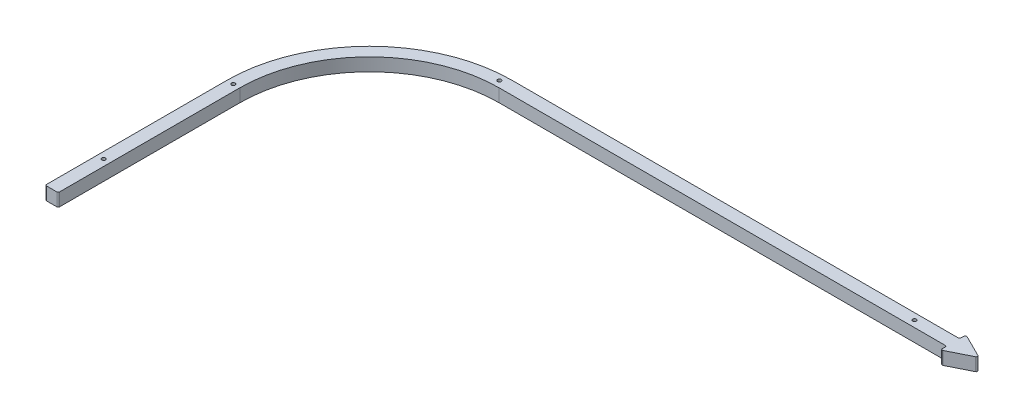
ISO-10303-21;
HEADER;
FILE_DESCRIPTION(('STEP AP214'),'2;1');
FILE_NAME('part.step','',(''),(''),'','','');
FILE_SCHEMA(('AUTOMOTIVE_DESIGN { 1 0 10303 214 1 1 1 1 }'));
ENDSEC;
DATA;
#1=APPLICATION_CONTEXT('core data for automotive mechanical design processes');
#2=APPLICATION_PROTOCOL_DEFINITION('international standard','automotive_design',2000,#1);
#3=PRODUCT_CONTEXT('',#1,'mechanical');
#4=PRODUCT('Part','Part','',(#3));
#5=PRODUCT_RELATED_PRODUCT_CATEGORY('part','',(#4));
#6=PRODUCT_DEFINITION_FORMATION('','',#4);
#7=PRODUCT_DEFINITION_CONTEXT('part definition',#1,'design');
#8=PRODUCT_DEFINITION('design','',#6,#7);
#9=PRODUCT_DEFINITION_SHAPE('','',#8);
#10=(LENGTH_UNIT() NAMED_UNIT(*) SI_UNIT(.MILLI.,.METRE.));
#11=(NAMED_UNIT(*) PLANE_ANGLE_UNIT() SI_UNIT($,.RADIAN.));
#12=(NAMED_UNIT(*) SI_UNIT($,.STERADIAN.) SOLID_ANGLE_UNIT());
#13=UNCERTAINTY_MEASURE_WITH_UNIT(LENGTH_MEASURE(1.E-05),#10,'distance_accuracy_value','');
#14=(GEOMETRIC_REPRESENTATION_CONTEXT(3) GLOBAL_UNCERTAINTY_ASSIGNED_CONTEXT((#13)) GLOBAL_UNIT_ASSIGNED_CONTEXT((#10,
#11,#12)) REPRESENTATION_CONTEXT('',''));
#15=CARTESIAN_POINT('',(0.,0.,0.));
#16=DIRECTION('',(0.,0.,1.));
#17=DIRECTION('',(1.,0.,0.));
#18=AXIS2_PLACEMENT_3D('',#15,#16,#17);
#19=CARTESIAN_POINT('',(0.,6.35,0.));
#20=DIRECTION('',(0.,1.,0.));
#21=DIRECTION('',(0.,0.,1.));
#22=AXIS2_PLACEMENT_3D('',#19,#20,#21);
#23=PLANE('',#22);
#24=CARTESIAN_POINT('',(3.175,6.35,-25.4));
#25=DIRECTION('',(0.,1.,0.));
#26=DIRECTION('',(0.,0.,1.));
#27=AXIS2_PLACEMENT_3D('',#24,#25,#26);
#28=CIRCLE('',#27,0.889);
#29=CARTESIAN_POINT('',(3.175,6.35,-24.511));
#30=VERTEX_POINT('',#29);
#31=EDGE_CURVE('E384',#30,#30,#28,.T.);
#32=ORIENTED_EDGE('',*,*,#31,.F.);
#33=EDGE_LOOP('',(#32));
#34=FACE_BOUND('',#33,.T.);
#35=CARTESIAN_POINT('',(66.8019999999998,6.35,-155.575));
#36=DIRECTION('',(0.,1.,0.));
#37=DIRECTION('',(0.,0.,1.));
#38=AXIS2_PLACEMENT_3D('',#35,#36,#37);
#39=CIRCLE('',#38,0.889000000000006);
#40=CARTESIAN_POINT('',(66.8019999999998,6.35,-154.686));
#41=VERTEX_POINT('',#40);
#42=EDGE_CURVE('E378',#41,#41,#39,.T.);
#43=ORIENTED_EDGE('',*,*,#42,.F.);
#44=EDGE_LOOP('',(#43));
#45=FACE_BOUND('',#44,.T.);
#46=CARTESIAN_POINT('',(3.17499999999978,6.35,-88.9));
#47=DIRECTION('',(0.,1.,0.));
#48=DIRECTION('',(0.,0.,1.));
#49=AXIS2_PLACEMENT_3D('',#46,#47,#48);
#50=CIRCLE('',#49,0.888999999999999);
#51=CARTESIAN_POINT('',(3.17499999999978,6.35,-88.011));
#52=VERTEX_POINT('',#51);
#53=EDGE_CURVE('E372',#52,#52,#50,.T.);
#54=ORIENTED_EDGE('',*,*,#53,.F.);
#55=EDGE_LOOP('',(#54));
#56=FACE_BOUND('',#55,.T.);
#57=CARTESIAN_POINT('',(270.002,6.35,-155.575));
#58=DIRECTION('',(0.,1.,0.));
#59=DIRECTION('',(0.,0.,1.));
#60=AXIS2_PLACEMENT_3D('',#57,#58,#59);
#61=CIRCLE('',#60,0.888999999999993);
#62=CARTESIAN_POINT('',(270.002,6.35,-154.686));
#63=VERTEX_POINT('',#62);
#64=EDGE_CURVE('E366',#63,#63,#61,.T.);
#65=ORIENTED_EDGE('',*,*,#64,.F.);
#66=EDGE_LOOP('',(#65));
#67=FACE_BOUND('',#66,.T.);
#68=DIRECTION('',(0.,0.,-1.));
#69=VECTOR('',#68,1.);
#70=CARTESIAN_POINT('',(0.,6.35,0.));
#71=LINE('',#70,#69);
#72=CARTESIAN_POINT('',(0.,6.35,-0.635));
#73=VERTEX_POINT('',#72);
#74=CARTESIAN_POINT('',(0.,6.35,-88.9));
#75=VERTEX_POINT('',#74);
#76=EDGE_CURVE('E232',#73,#75,#71,.T.);
#77=ORIENTED_EDGE('',*,*,#76,.F.);
#78=CARTESIAN_POINT('',(0.635,6.35,-0.635));
#79=DIRECTION('',(0.,1.,0.));
#80=DIRECTION('',(0.,0.,1.));
#81=AXIS2_PLACEMENT_3D('',#78,#79,#80);
#82=CIRCLE('',#81,0.635);
#83=CARTESIAN_POINT('',(0.635,6.35,0.));
#84=VERTEX_POINT('',#83);
#85=EDGE_CURVE('E288',#73,#84,#82,.T.);
#86=ORIENTED_EDGE('',*,*,#85,.T.);
#87=DIRECTION('',(1.,0.,0.));
#88=VECTOR('',#87,1.);
#89=CARTESIAN_POINT('',(0.,6.35,0.));
#90=LINE('',#89,#88);
#91=CARTESIAN_POINT('',(5.715,6.35,0.));
#92=VERTEX_POINT('',#91);
#93=EDGE_CURVE('E206',#84,#92,#90,.T.);
#94=ORIENTED_EDGE('',*,*,#93,.T.);
#95=CARTESIAN_POINT('',(5.715,6.35,-0.635));
#96=DIRECTION('',(0.,1.,0.));
#97=DIRECTION('',(0.,0.,1.));
#98=AXIS2_PLACEMENT_3D('',#95,#96,#97);
#99=CIRCLE('',#98,0.635);
#100=CARTESIAN_POINT('',(6.35,6.35,-0.635));
#101=VERTEX_POINT('',#100);
#102=EDGE_CURVE('E202',#92,#101,#99,.T.);
#103=ORIENTED_EDGE('',*,*,#102,.T.);
#104=DIRECTION('',(0.,0.,-1.));
#105=VECTOR('',#104,1.);
#106=CARTESIAN_POINT('',(6.35,6.35,0.));
#107=LINE('',#106,#105);
#108=CARTESIAN_POINT('',(6.35,6.35,-88.9));
#109=VERTEX_POINT('',#108);
#110=EDGE_CURVE('E194',#101,#109,#107,.T.);
#111=ORIENTED_EDGE('',*,*,#110,.T.);
#112=CARTESIAN_POINT('',(69.85,6.35,-88.9));
#113=DIRECTION('',(0.,1.,0.));
#114=DIRECTION('',(0.,0.,1.));
#115=AXIS2_PLACEMENT_3D('',#112,#113,#114);
#116=CIRCLE('',#115,63.5);
#117=CARTESIAN_POINT('',(69.85,6.35,-152.4));
#118=VERTEX_POINT('',#117);
#119=EDGE_CURVE('E198',#109,#118,#116,.F.);
#120=ORIENTED_EDGE('',*,*,#119,.T.);
#121=DIRECTION('',(1.,0.,0.));
#122=VECTOR('',#121,1.);
#123=CARTESIAN_POINT('',(0.,6.35,-152.4));
#124=LINE('',#123,#122);
#125=CARTESIAN_POINT('',(288.29,6.35,-152.4));
#126=VERTEX_POINT('',#125);
#127=EDGE_CURVE('E221',#118,#126,#124,.T.);
#128=ORIENTED_EDGE('',*,*,#127,.T.);
#129=CARTESIAN_POINT('',(288.29,6.35,-151.765));
#130=DIRECTION('',(0.,1.,0.));
#131=DIRECTION('',(0.,0.,1.));
#132=AXIS2_PLACEMENT_3D('',#129,#130,#131);
#133=CIRCLE('',#132,0.635);
#134=CARTESIAN_POINT('',(288.925,6.35,-151.765));
#135=VERTEX_POINT('',#134);
#136=EDGE_CURVE('E85',#126,#135,#133,.F.);
#137=ORIENTED_EDGE('',*,*,#136,.T.);
#138=DIRECTION('',(0.,0.,-1.));
#139=VECTOR('',#138,1.);
#140=CARTESIAN_POINT('',(288.925,6.35,-149.225));
#141=LINE('',#140,#139);
#142=CARTESIAN_POINT('',(288.925,6.35,-150.252451582856));
#143=VERTEX_POINT('',#142);
#144=EDGE_CURVE('E238',#143,#135,#141,.T.);
#145=ORIENTED_EDGE('',*,*,#144,.F.);
#146=CARTESIAN_POINT('',(289.56,6.35000000000002,-150.252451582856));
#147=DIRECTION('',(0.,1.,0.));
#148=DIRECTION('',(0.,0.,1.));
#149=AXIS2_PLACEMENT_3D('',#146,#147,#148);
#150=CIRCLE('',#149,0.635);
#151=CARTESIAN_POINT('',(289.843980633143,6.35,-149.684490316571));
#152=VERTEX_POINT('',#151);
#153=EDGE_CURVE('E285',#143,#152,#150,.T.);
#154=ORIENTED_EDGE('',*,*,#153,.T.);
#155=DIRECTION('',(0.894427190999917,0.,-0.447213595499956));
#156=VECTOR('',#155,1.);
#157=CARTESIAN_POINT('',(-1.90500000000027,6.35,-3.81000000000056));
#158=LINE('',#157,#156);
#159=CARTESIAN_POINT('',(300.48907746743,6.35,-155.007038733715));
#160=VERTEX_POINT('',#159);
#161=EDGE_CURVE('E264',#152,#160,#158,.T.);
#162=ORIENTED_EDGE('',*,*,#161,.T.);
#163=CARTESIAN_POINT('',(300.205096834288,6.35000000000002,-155.575));
#164=DIRECTION('',(0.,1.,0.));
#165=DIRECTION('',(0.,0.,1.));
#166=AXIS2_PLACEMENT_3D('',#163,#164,#165);
#167=CIRCLE('',#166,0.635);
#168=CARTESIAN_POINT('',(300.48907746743,6.35,-156.142961266285));
#169=VERTEX_POINT('',#168);
#170=EDGE_CURVE('E283',#160,#169,#167,.T.);
#171=ORIENTED_EDGE('',*,*,#170,.T.);
#172=DIRECTION('',(-0.894427190999916,0.,-0.447213595499958));
#173=VECTOR('',#172,1.);
#174=CARTESIAN_POINT('',(122.555,6.35,-245.11));
#175=LINE('',#174,#173);
#176=CARTESIAN_POINT('',(289.843980633143,6.35,-161.465509683429));
#177=VERTEX_POINT('',#176);
#178=EDGE_CURVE('E359',#169,#177,#175,.T.);
#179=ORIENTED_EDGE('',*,*,#178,.T.);
#180=CARTESIAN_POINT('',(289.56,6.35,-160.897548417144));
#181=DIRECTION('',(0.,1.,0.));
#182=DIRECTION('',(0.,0.,1.));
#183=AXIS2_PLACEMENT_3D('',#180,#181,#182);
#184=CIRCLE('',#183,0.635);
#185=CARTESIAN_POINT('',(288.925,6.35,-160.897548417144));
#186=VERTEX_POINT('',#185);
#187=EDGE_CURVE('E281',#177,#186,#184,.T.);
#188=ORIENTED_EDGE('',*,*,#187,.T.);
#189=CARTESIAN_POINT('',(288.925,6.35,-159.385));
#190=VERTEX_POINT('',#189);
#191=EDGE_CURVE('E259',#190,#186,#141,.T.);
#192=ORIENTED_EDGE('',*,*,#191,.F.);
#193=CARTESIAN_POINT('',(288.29,6.35,-159.385));
#194=DIRECTION('',(0.,1.,0.));
#195=DIRECTION('',(0.,0.,1.));
#196=AXIS2_PLACEMENT_3D('',#193,#194,#195);
#197=CIRCLE('',#196,0.635);
#198=CARTESIAN_POINT('',(288.29,6.35,-158.75));
#199=VERTEX_POINT('',#198);
#200=EDGE_CURVE('E12',#190,#199,#197,.F.);
#201=ORIENTED_EDGE('',*,*,#200,.T.);
#202=DIRECTION('',(1.,0.,0.));
#203=VECTOR('',#202,1.);
#204=CARTESIAN_POINT('',(0.,6.35,-158.75));
#205=LINE('',#204,#203);
#206=CARTESIAN_POINT('',(69.85,6.35,-158.75));
#207=VERTEX_POINT('',#206);
#208=EDGE_CURVE('E223',#207,#199,#205,.T.);
#209=ORIENTED_EDGE('',*,*,#208,.F.);
#210=CARTESIAN_POINT('',(69.85,6.35,-88.9));
#211=DIRECTION('',(0.,1.,0.));
#212=DIRECTION('',(0.,0.,1.));
#213=AXIS2_PLACEMENT_3D('',#210,#211,#212);
#214=CIRCLE('',#213,69.85);
#215=EDGE_CURVE('E229',#75,#207,#214,.F.);
#216=ORIENTED_EDGE('',*,*,#215,.F.);
#217=EDGE_LOOP('',(#77,#86,#94,#103,#111,#120,#128,#137,#145,#154,#162,#171,#179,#188,#192,#201,
#209,#216));
#218=FACE_BOUND('',#217,.T.);
#219=ADVANCED_FACE('F70',(#34,#45,#56,#67,#218),#23,.T.);
#220=CARTESIAN_POINT('',(0.,0.,0.));
#221=DIRECTION('',(0.,1.,0.));
#222=DIRECTION('',(0.,0.,1.));
#223=AXIS2_PLACEMENT_3D('',#220,#221,#222);
#224=PLANE('',#223);
#225=CARTESIAN_POINT('',(3.175,0.,-25.4));
#226=DIRECTION('',(0.,1.,0.));
#227=DIRECTION('',(0.,0.,1.));
#228=AXIS2_PLACEMENT_3D('',#225,#226,#227);
#229=CIRCLE('',#228,0.889);
#230=CARTESIAN_POINT('',(3.175,0.,-24.511));
#231=VERTEX_POINT('',#230);
#232=EDGE_CURVE('E365',#231,#231,#229,.T.);
#233=ORIENTED_EDGE('',*,*,#232,.T.);
#234=EDGE_LOOP('',(#233));
#235=FACE_BOUND('',#234,.T.);
#236=CARTESIAN_POINT('',(66.8019999999998,0.,-155.575));
#237=DIRECTION('',(0.,1.,0.));
#238=DIRECTION('',(0.,0.,1.));
#239=AXIS2_PLACEMENT_3D('',#236,#237,#238);
#240=CIRCLE('',#239,0.889000000000006);
#241=CARTESIAN_POINT('',(66.8019999999998,0.,-154.686));
#242=VERTEX_POINT('',#241);
#243=EDGE_CURVE('E381',#242,#242,#240,.T.);
#244=ORIENTED_EDGE('',*,*,#243,.T.);
#245=EDGE_LOOP('',(#244));
#246=FACE_BOUND('',#245,.T.);
#247=CARTESIAN_POINT('',(3.17499999999978,0.,-88.9));
#248=DIRECTION('',(0.,1.,0.));
#249=DIRECTION('',(0.,0.,1.));
#250=AXIS2_PLACEMENT_3D('',#247,#248,#249);
#251=CIRCLE('',#250,0.888999999999999);
#252=CARTESIAN_POINT('',(3.17499999999978,0.,-88.011));
#253=VERTEX_POINT('',#252);
#254=EDGE_CURVE('E375',#253,#253,#251,.T.);
#255=ORIENTED_EDGE('',*,*,#254,.T.);
#256=EDGE_LOOP('',(#255));
#257=FACE_BOUND('',#256,.T.);
#258=CARTESIAN_POINT('',(270.002,0.,-155.575));
#259=DIRECTION('',(0.,1.,0.));
#260=DIRECTION('',(0.,0.,1.));
#261=AXIS2_PLACEMENT_3D('',#258,#259,#260);
#262=CIRCLE('',#261,0.888999999999993);
#263=CARTESIAN_POINT('',(270.002,0.,-154.686));
#264=VERTEX_POINT('',#263);
#265=EDGE_CURVE('E369',#264,#264,#262,.T.);
#266=ORIENTED_EDGE('',*,*,#265,.T.);
#267=EDGE_LOOP('',(#266));
#268=FACE_BOUND('',#267,.T.);
#269=DIRECTION('',(1.,0.,0.));
#270=VECTOR('',#269,1.);
#271=CARTESIAN_POINT('',(0.,0.,0.));
#272=LINE('',#271,#270);
#273=CARTESIAN_POINT('',(0.635,0.,0.));
#274=VERTEX_POINT('',#273);
#275=CARTESIAN_POINT('',(5.715,0.,0.));
#276=VERTEX_POINT('',#275);
#277=EDGE_CURVE('E235',#274,#276,#272,.T.);
#278=ORIENTED_EDGE('',*,*,#277,.F.);
#279=CARTESIAN_POINT('',(0.635,0.,-0.635));
#280=DIRECTION('',(0.,1.,0.));
#281=DIRECTION('',(0.,0.,1.));
#282=AXIS2_PLACEMENT_3D('',#279,#280,#281);
#283=CIRCLE('',#282,0.635);
#284=CARTESIAN_POINT('',(0.,0.,-0.635));
#285=VERTEX_POINT('',#284);
#286=EDGE_CURVE('E277',#274,#285,#283,.F.);
#287=ORIENTED_EDGE('',*,*,#286,.T.);
#288=DIRECTION('',(0.,0.,-1.));
#289=VECTOR('',#288,1.);
#290=CARTESIAN_POINT('',(0.,0.,0.));
#291=LINE('',#290,#289);
#292=CARTESIAN_POINT('',(0.,0.,-88.9));
#293=VERTEX_POINT('',#292);
#294=EDGE_CURVE('E251',#285,#293,#291,.T.);
#295=ORIENTED_EDGE('',*,*,#294,.T.);
#296=CARTESIAN_POINT('',(69.85,0.,-88.9));
#297=DIRECTION('',(0.,1.,0.));
#298=DIRECTION('',(0.,0.,1.));
#299=AXIS2_PLACEMENT_3D('',#296,#297,#298);
#300=CIRCLE('',#299,69.85);
#301=CARTESIAN_POINT('',(69.85,0.,-158.75));
#302=VERTEX_POINT('',#301);
#303=EDGE_CURVE('E248',#293,#302,#300,.F.);
#304=ORIENTED_EDGE('',*,*,#303,.T.);
#305=DIRECTION('',(1.,0.,0.));
#306=VECTOR('',#305,1.);
#307=CARTESIAN_POINT('',(0.,0.,-158.75));
#308=LINE('',#307,#306);
#309=CARTESIAN_POINT('',(288.29,0.,-158.75));
#310=VERTEX_POINT('',#309);
#311=EDGE_CURVE('E245',#302,#310,#308,.T.);
#312=ORIENTED_EDGE('',*,*,#311,.T.);
#313=CARTESIAN_POINT('',(288.29,0.,-159.385));
#314=DIRECTION('',(0.,1.,0.));
#315=DIRECTION('',(0.,0.,1.));
#316=AXIS2_PLACEMENT_3D('',#313,#314,#315);
#317=CIRCLE('',#316,0.635);
#318=CARTESIAN_POINT('',(288.925,0.,-159.385));
#319=VERTEX_POINT('',#318);
#320=EDGE_CURVE('E78',#310,#319,#317,.T.);
#321=ORIENTED_EDGE('',*,*,#320,.T.);
#322=DIRECTION('',(0.,0.,-1.));
#323=VECTOR('',#322,1.);
#324=CARTESIAN_POINT('',(288.925,0.,-149.225));
#325=LINE('',#324,#323);
#326=CARTESIAN_POINT('',(288.925,0.,-160.897548417144));
#327=VERTEX_POINT('',#326);
#328=EDGE_CURVE('E260',#319,#327,#325,.T.);
#329=ORIENTED_EDGE('',*,*,#328,.T.);
#330=CARTESIAN_POINT('',(289.56,0.,-160.897548417144));
#331=DIRECTION('',(0.,1.,0.));
#332=DIRECTION('',(0.,0.,1.));
#333=AXIS2_PLACEMENT_3D('',#330,#331,#332);
#334=CIRCLE('',#333,0.635);
#335=CARTESIAN_POINT('',(289.843980633143,0.,-161.465509683429));
#336=VERTEX_POINT('',#335);
#337=EDGE_CURVE('E269',#327,#336,#334,.F.);
#338=ORIENTED_EDGE('',*,*,#337,.T.);
#339=DIRECTION('',(-0.894427190999916,0.,-0.447213595499958));
#340=VECTOR('',#339,1.);
#341=CARTESIAN_POINT('',(122.555,0.,-245.11));
#342=LINE('',#341,#340);
#343=CARTESIAN_POINT('',(300.48907746743,0.,-156.142961266285));
#344=VERTEX_POINT('',#343);
#345=EDGE_CURVE('E362',#344,#336,#342,.T.);
#346=ORIENTED_EDGE('',*,*,#345,.F.);
#347=CARTESIAN_POINT('',(300.205096834288,0.,-155.575));
#348=DIRECTION('',(0.,1.,0.));
#349=DIRECTION('',(0.,0.,1.));
#350=AXIS2_PLACEMENT_3D('',#347,#348,#349);
#351=CIRCLE('',#350,0.635);
#352=CARTESIAN_POINT('',(300.48907746743,0.,-155.007038733715));
#353=VERTEX_POINT('',#352);
#354=EDGE_CURVE('E271',#344,#353,#351,.F.);
#355=ORIENTED_EDGE('',*,*,#354,.T.);
#356=DIRECTION('',(0.894427190999917,0.,-0.447213595499956));
#357=VECTOR('',#356,1.);
#358=CARTESIAN_POINT('',(-1.90500000000027,0.,-3.81000000000056));
#359=LINE('',#358,#357);
#360=CARTESIAN_POINT('',(289.843980633143,0.,-149.684490316571));
#361=VERTEX_POINT('',#360);
#362=EDGE_CURVE('E356',#361,#353,#359,.T.);
#363=ORIENTED_EDGE('',*,*,#362,.F.);
#364=CARTESIAN_POINT('',(289.56,0.,-150.252451582856));
#365=DIRECTION('',(0.,1.,0.));
#366=DIRECTION('',(0.,0.,1.));
#367=AXIS2_PLACEMENT_3D('',#364,#365,#366);
#368=CIRCLE('',#367,0.635);
#369=CARTESIAN_POINT('',(288.925,0.,-150.252451582856));
#370=VERTEX_POINT('',#369);
#371=EDGE_CURVE('E273',#361,#370,#368,.F.);
#372=ORIENTED_EDGE('',*,*,#371,.T.);
#373=CARTESIAN_POINT('',(288.925,0.,-151.765));
#374=VERTEX_POINT('',#373);
#375=EDGE_CURVE('E263',#370,#374,#325,.T.);
#376=ORIENTED_EDGE('',*,*,#375,.T.);
#377=CARTESIAN_POINT('',(288.29,0.,-151.765));
#378=DIRECTION('',(0.,1.,0.));
#379=DIRECTION('',(0.,0.,1.));
#380=AXIS2_PLACEMENT_3D('',#377,#378,#379);
#381=CIRCLE('',#380,0.635);
#382=CARTESIAN_POINT('',(288.29,0.,-152.4));
#383=VERTEX_POINT('',#382);
#384=EDGE_CURVE('E316',#374,#383,#381,.T.);
#385=ORIENTED_EDGE('',*,*,#384,.T.);
#386=DIRECTION('',(1.,0.,0.));
#387=VECTOR('',#386,1.);
#388=CARTESIAN_POINT('',(0.,0.,-152.4));
#389=LINE('',#388,#387);
#390=CARTESIAN_POINT('',(69.85,0.,-152.4));
#391=VERTEX_POINT('',#390);
#392=EDGE_CURVE('E242',#391,#383,#389,.T.);
#393=ORIENTED_EDGE('',*,*,#392,.F.);
#394=CARTESIAN_POINT('',(69.85,0.,-88.9));
#395=DIRECTION('',(0.,1.,0.));
#396=DIRECTION('',(0.,0.,1.));
#397=AXIS2_PLACEMENT_3D('',#394,#395,#396);
#398=CIRCLE('',#397,63.5);
#399=CARTESIAN_POINT('',(6.35,0.,-88.9));
#400=VERTEX_POINT('',#399);
#401=EDGE_CURVE('E240',#400,#391,#398,.F.);
#402=ORIENTED_EDGE('',*,*,#401,.F.);
#403=DIRECTION('',(0.,0.,-1.));
#404=VECTOR('',#403,1.);
#405=CARTESIAN_POINT('',(6.35,0.,0.));
#406=LINE('',#405,#404);
#407=CARTESIAN_POINT('',(6.35,0.,-0.635));
#408=VERTEX_POINT('',#407);
#409=EDGE_CURVE('E212',#408,#400,#406,.T.);
#410=ORIENTED_EDGE('',*,*,#409,.F.);
#411=CARTESIAN_POINT('',(5.715,0.,-0.635));
#412=DIRECTION('',(0.,1.,0.));
#413=DIRECTION('',(0.,0.,1.));
#414=AXIS2_PLACEMENT_3D('',#411,#412,#413);
#415=CIRCLE('',#414,0.635);
#416=EDGE_CURVE('E275',#408,#276,#415,.F.);
#417=ORIENTED_EDGE('',*,*,#416,.T.);
#418=EDGE_LOOP('',(#278,#287,#295,#304,#312,#321,#329,#338,#346,#355,#363,#372,#376,#385,#393,
#402,#410,#417));
#419=FACE_BOUND('',#418,.T.);
#420=ADVANCED_FACE('F321',(#235,#246,#257,#268,#419),#224,.F.);
#421=CARTESIAN_POINT('',(0.,6.35,0.));
#422=DIRECTION('',(0.,0.,-1.));
#423=DIRECTION('',(-1.,0.,0.));
#424=AXIS2_PLACEMENT_3D('',#421,#422,#423);
#425=PLANE('',#424);
#426=ORIENTED_EDGE('',*,*,#93,.F.);
#427=DIRECTION('',(0.,-1.,0.));
#428=VECTOR('',#427,1.);
#429=CARTESIAN_POINT('',(0.635,0.,0.));
#430=LINE('',#429,#428);
#431=EDGE_CURVE('E266',#84,#274,#430,.T.);
#432=ORIENTED_EDGE('',*,*,#431,.T.);
#433=ORIENTED_EDGE('',*,*,#277,.T.);
#434=DIRECTION('',(0.,-1.,0.));
#435=VECTOR('',#434,1.);
#436=CARTESIAN_POINT('',(5.715,6.35,0.));
#437=LINE('',#436,#435);
#438=EDGE_CURVE('E215',#276,#92,#437,.F.);
#439=ORIENTED_EDGE('',*,*,#438,.T.);
#440=EDGE_LOOP('',(#426,#432,#433,#439));
#441=FACE_BOUND('',#440,.T.);
#442=ADVANCED_FACE('F348',(#441),#425,.F.);
#443=CARTESIAN_POINT('',(6.35,6.35,0.));
#444=DIRECTION('',(-1.,0.,0.));
#445=DIRECTION('',(0.,0.,1.));
#446=AXIS2_PLACEMENT_3D('',#443,#444,#445);
#447=PLANE('',#446);
#448=ORIENTED_EDGE('',*,*,#110,.F.);
#449=DIRECTION('',(0.,-1.,0.));
#450=VECTOR('',#449,1.);
#451=CARTESIAN_POINT('',(6.35,6.35,-0.635));
#452=LINE('',#451,#450);
#453=EDGE_CURVE('E290',#101,#408,#452,.T.);
#454=ORIENTED_EDGE('',*,*,#453,.T.);
#455=ORIENTED_EDGE('',*,*,#409,.T.);
#456=DIRECTION('',(0.,-1.,0.));
#457=VECTOR('',#456,1.);
#458=CARTESIAN_POINT('',(6.35,6.35,-88.9));
#459=LINE('',#458,#457);
#460=EDGE_CURVE('E209',#109,#400,#459,.T.);
#461=ORIENTED_EDGE('',*,*,#460,.F.);
#462=EDGE_LOOP('',(#448,#454,#455,#461));
#463=FACE_BOUND('',#462,.T.);
#464=ADVANCED_FACE('F210',(#463),#447,.F.);
#465=CARTESIAN_POINT('',(69.85,6.35,-88.9));
#466=DIRECTION('',(0.,-1.,0.));
#467=DIRECTION('',(0.,0.,-1.));
#468=AXIS2_PLACEMENT_3D('',#465,#466,#467);
#469=CYLINDRICAL_SURFACE('',#468,63.5);
#470=ORIENTED_EDGE('',*,*,#401,.T.);
#471=DIRECTION('',(0.,-1.,0.));
#472=VECTOR('',#471,1.);
#473=CARTESIAN_POINT('',(69.85,6.35,-152.4));
#474=LINE('',#473,#472);
#475=EDGE_CURVE('E216',#118,#391,#474,.T.);
#476=ORIENTED_EDGE('',*,*,#475,.F.);
#477=ORIENTED_EDGE('',*,*,#119,.F.);
#478=ORIENTED_EDGE('',*,*,#460,.T.);
#479=EDGE_LOOP('',(#470,#476,#477,#478));
#480=FACE_BOUND('',#479,.T.);
#481=ADVANCED_FACE('F218',(#480),#469,.F.);
#482=CARTESIAN_POINT('',(0.,6.35,-152.4));
#483=DIRECTION('',(0.,0.,-1.));
#484=DIRECTION('',(-1.,0.,0.));
#485=AXIS2_PLACEMENT_3D('',#482,#483,#484);
#486=PLANE('',#485);
#487=ORIENTED_EDGE('',*,*,#392,.T.);
#488=DIRECTION('',(0.,-1.,0.));
#489=VECTOR('',#488,1.);
#490=CARTESIAN_POINT('',(288.29,6.35,-152.4));
#491=LINE('',#490,#489);
#492=EDGE_CURVE('E301',#383,#126,#491,.F.);
#493=ORIENTED_EDGE('',*,*,#492,.T.);
#494=ORIENTED_EDGE('',*,*,#127,.F.);
#495=ORIENTED_EDGE('',*,*,#475,.T.);
#496=EDGE_LOOP('',(#487,#493,#494,#495));
#497=FACE_BOUND('',#496,.T.);
#498=ADVANCED_FACE('F441',(#497),#486,.F.);
#499=CARTESIAN_POINT('',(0.,6.35,-158.75));
#500=DIRECTION('',(0.,0.,-1.));
#501=DIRECTION('',(-1.,0.,0.));
#502=AXIS2_PLACEMENT_3D('',#499,#500,#501);
#503=PLANE('',#502);
#504=ORIENTED_EDGE('',*,*,#208,.T.);
#505=DIRECTION('',(0.,-1.,0.));
#506=VECTOR('',#505,1.);
#507=CARTESIAN_POINT('',(288.29,0.,-158.75));
#508=LINE('',#507,#506);
#509=EDGE_CURVE('E313',#199,#310,#508,.T.);
#510=ORIENTED_EDGE('',*,*,#509,.T.);
#511=ORIENTED_EDGE('',*,*,#311,.F.);
#512=DIRECTION('',(0.,-1.,0.));
#513=VECTOR('',#512,1.);
#514=CARTESIAN_POINT('',(69.85,6.35,-158.75));
#515=LINE('',#514,#513);
#516=EDGE_CURVE('E255',#207,#302,#515,.T.);
#517=ORIENTED_EDGE('',*,*,#516,.F.);
#518=EDGE_LOOP('',(#504,#510,#511,#517));
#519=FACE_BOUND('',#518,.T.);
#520=ADVANCED_FACE('F335',(#519),#503,.T.);
#521=CARTESIAN_POINT('',(69.85,6.35,-88.9));
#522=DIRECTION('',(0.,-1.,0.));
#523=DIRECTION('',(0.,0.,-1.));
#524=AXIS2_PLACEMENT_3D('',#521,#522,#523);
#525=CYLINDRICAL_SURFACE('',#524,69.85);
#526=ORIENTED_EDGE('',*,*,#303,.F.);
#527=DIRECTION('',(0.,-1.,0.));
#528=VECTOR('',#527,1.);
#529=CARTESIAN_POINT('',(0.,6.35,-88.9));
#530=LINE('',#529,#528);
#531=EDGE_CURVE('E234',#75,#293,#530,.T.);
#532=ORIENTED_EDGE('',*,*,#531,.F.);
#533=ORIENTED_EDGE('',*,*,#215,.T.);
#534=ORIENTED_EDGE('',*,*,#516,.T.);
#535=EDGE_LOOP('',(#526,#532,#533,#534));
#536=FACE_BOUND('',#535,.T.);
#537=ADVANCED_FACE('F338',(#536),#525,.T.);
#538=CARTESIAN_POINT('',(0.,6.35,0.));
#539=DIRECTION('',(-1.,0.,0.));
#540=DIRECTION('',(0.,0.,1.));
#541=AXIS2_PLACEMENT_3D('',#538,#539,#540);
#542=PLANE('',#541);
#543=ORIENTED_EDGE('',*,*,#294,.F.);
#544=DIRECTION('',(0.,-1.,0.));
#545=VECTOR('',#544,1.);
#546=CARTESIAN_POINT('',(0.,6.35,-0.635));
#547=LINE('',#546,#545);
#548=EDGE_CURVE('E279',#285,#73,#547,.F.);
#549=ORIENTED_EDGE('',*,*,#548,.T.);
#550=ORIENTED_EDGE('',*,*,#76,.T.);
#551=ORIENTED_EDGE('',*,*,#531,.T.);
#552=EDGE_LOOP('',(#543,#549,#550,#551));
#553=FACE_BOUND('',#552,.T.);
#554=ADVANCED_FACE('F428',(#553),#542,.T.);
#555=CARTESIAN_POINT('',(288.925,6.35,-149.225));
#556=DIRECTION('',(-1.,0.,0.));
#557=DIRECTION('',(0.,0.,1.));
#558=AXIS2_PLACEMENT_3D('',#555,#556,#557);
#559=PLANE('',#558);
#560=ORIENTED_EDGE('',*,*,#375,.F.);
#561=DIRECTION('',(0.,-1.,0.));
#562=VECTOR('',#561,1.);
#563=CARTESIAN_POINT('',(288.925,6.35,-150.252451582856));
#564=LINE('',#563,#562);
#565=EDGE_CURVE('E92',#370,#143,#564,.F.);
#566=ORIENTED_EDGE('',*,*,#565,.T.);
#567=ORIENTED_EDGE('',*,*,#144,.T.);
#568=DIRECTION('',(0.,-1.,0.));
#569=VECTOR('',#568,1.);
#570=CARTESIAN_POINT('',(288.925,6.35,-151.765));
#571=LINE('',#570,#569);
#572=EDGE_CURVE('E297',#135,#374,#571,.T.);
#573=ORIENTED_EDGE('',*,*,#572,.T.);
#574=EDGE_LOOP('',(#560,#566,#567,#573));
#575=FACE_BOUND('',#574,.T.);
#576=ADVANCED_FACE('F436',(#575),#559,.T.);
#577=ORIENTED_EDGE('',*,*,#191,.T.);
#578=DIRECTION('',(0.,-1.,0.));
#579=VECTOR('',#578,1.);
#580=CARTESIAN_POINT('',(288.925,6.35,-160.897548417144));
#581=LINE('',#580,#579);
#582=EDGE_CURVE('E310',#186,#327,#581,.T.);
#583=ORIENTED_EDGE('',*,*,#582,.T.);
#584=ORIENTED_EDGE('',*,*,#328,.F.);
#585=DIRECTION('',(0.,-1.,0.));
#586=VECTOR('',#585,1.);
#587=CARTESIAN_POINT('',(288.925,6.35,-159.385));
#588=LINE('',#587,#586);
#589=EDGE_CURVE('E308',#319,#190,#588,.F.);
#590=ORIENTED_EDGE('',*,*,#589,.T.);
#591=EDGE_LOOP('',(#577,#583,#584,#590));
#592=FACE_BOUND('',#591,.T.);
#593=ADVANCED_FACE('F328',(#592),#559,.T.);
#594=CARTESIAN_POINT('',(301.625,442.287333436737,-155.575));
#595=DIRECTION('',(0.447213595499956,0.,0.894427190999917));
#596=DIRECTION('',(0.894427190999917,0.,-0.447213595499956));
#597=AXIS2_PLACEMENT_3D('',#594,#595,#596);
#598=PLANE('',#597);
#599=ORIENTED_EDGE('',*,*,#161,.F.);
#600=DIRECTION('',(0.,-1.,0.));
#601=VECTOR('',#600,1.);
#602=CARTESIAN_POINT('',(289.843980633143,442.287333436737,-149.684490316571));
#603=LINE('',#602,#601);
#604=EDGE_CURVE('E294',#152,#361,#603,.T.);
#605=ORIENTED_EDGE('',*,*,#604,.T.);
#606=ORIENTED_EDGE('',*,*,#362,.T.);
#607=DIRECTION('',(0.,-1.,0.));
#608=VECTOR('',#607,1.);
#609=CARTESIAN_POINT('',(300.48907746743,442.287333436737,-155.007038733715));
#610=LINE('',#609,#608);
#611=EDGE_CURVE('E292',#353,#160,#610,.F.);
#612=ORIENTED_EDGE('',*,*,#611,.T.);
#613=EDGE_LOOP('',(#599,#605,#606,#612));
#614=FACE_BOUND('',#613,.T.);
#615=ADVANCED_FACE('F423',(#614),#598,.T.);
#616=CARTESIAN_POINT('',(288.925,442.287333436737,-161.925));
#617=DIRECTION('',(0.447213595499958,0.,-0.894427190999916));
#618=DIRECTION('',(-0.894427190999916,0.,-0.447213595499958));
#619=AXIS2_PLACEMENT_3D('',#616,#617,#618);
#620=PLANE('',#619);
#621=ORIENTED_EDGE('',*,*,#178,.F.);
#622=DIRECTION('',(0.,-1.,0.));
#623=VECTOR('',#622,1.);
#624=CARTESIAN_POINT('',(300.48907746743,442.287333436737,-156.142961266285));
#625=LINE('',#624,#623);
#626=EDGE_CURVE('E305',#169,#344,#625,.T.);
#627=ORIENTED_EDGE('',*,*,#626,.T.);
#628=ORIENTED_EDGE('',*,*,#345,.T.);
#629=DIRECTION('',(0.,-1.,0.));
#630=VECTOR('',#629,1.);
#631=CARTESIAN_POINT('',(289.843980633143,442.287333436737,-161.465509683429));
#632=LINE('',#631,#630);
#633=EDGE_CURVE('E303',#336,#177,#632,.F.);
#634=ORIENTED_EDGE('',*,*,#633,.T.);
#635=EDGE_LOOP('',(#621,#627,#628,#634));
#636=FACE_BOUND('',#635,.T.);
#637=ADVANCED_FACE('F426',(#636),#620,.T.);
#638=CARTESIAN_POINT('',(0.635,6.35,-0.635));
#639=DIRECTION('',(0.,1.,0.));
#640=DIRECTION('',(0.,0.,1.));
#641=AXIS2_PLACEMENT_3D('',#638,#639,#640);
#642=CYLINDRICAL_SURFACE('',#641,0.635);
#643=ORIENTED_EDGE('',*,*,#85,.F.);
#644=ORIENTED_EDGE('',*,*,#548,.F.);
#645=ORIENTED_EDGE('',*,*,#286,.F.);
#646=ORIENTED_EDGE('',*,*,#431,.F.);
#647=EDGE_LOOP('',(#643,#644,#645,#646));
#648=FACE_BOUND('',#647,.T.);
#649=ADVANCED_FACE('F346',(#648),#642,.T.);
#650=CARTESIAN_POINT('',(5.715,6.35,-0.635));
#651=DIRECTION('',(0.,-1.,0.));
#652=DIRECTION('',(0.,0.,-1.));
#653=AXIS2_PLACEMENT_3D('',#650,#651,#652);
#654=CYLINDRICAL_SURFACE('',#653,0.635);
#655=ORIENTED_EDGE('',*,*,#102,.F.);
#656=ORIENTED_EDGE('',*,*,#438,.F.);
#657=ORIENTED_EDGE('',*,*,#416,.F.);
#658=ORIENTED_EDGE('',*,*,#453,.F.);
#659=EDGE_LOOP('',(#655,#656,#657,#658));
#660=FACE_BOUND('',#659,.T.);
#661=ADVANCED_FACE('F352',(#660),#654,.T.);
#662=CARTESIAN_POINT('',(289.56,442.287333436737,-150.252451582856));
#663=DIRECTION('',(0.,-1.,0.));
#664=DIRECTION('',(0.,0.,-1.));
#665=AXIS2_PLACEMENT_3D('',#662,#663,#664);
#666=CYLINDRICAL_SURFACE('',#665,0.635);
#667=ORIENTED_EDGE('',*,*,#153,.F.);
#668=ORIENTED_EDGE('',*,*,#565,.F.);
#669=ORIENTED_EDGE('',*,*,#371,.F.);
#670=ORIENTED_EDGE('',*,*,#604,.F.);
#671=EDGE_LOOP('',(#667,#668,#669,#670));
#672=FACE_BOUND('',#671,.T.);
#673=ADVANCED_FACE('F457',(#672),#666,.T.);
#674=CARTESIAN_POINT('',(288.29,6.35,-151.765));
#675=DIRECTION('',(0.,-1.,0.));
#676=DIRECTION('',(0.,0.,-1.));
#677=AXIS2_PLACEMENT_3D('',#674,#675,#676);
#678=CYLINDRICAL_SURFACE('',#677,0.635);
#679=ORIENTED_EDGE('',*,*,#136,.F.);
#680=ORIENTED_EDGE('',*,*,#492,.F.);
#681=ORIENTED_EDGE('',*,*,#384,.F.);
#682=ORIENTED_EDGE('',*,*,#572,.F.);
#683=EDGE_LOOP('',(#679,#680,#681,#682));
#684=FACE_BOUND('',#683,.T.);
#685=ADVANCED_FACE('F460',(#684),#678,.F.);
#686=CARTESIAN_POINT('',(300.205096834288,442.287333436737,-155.575));
#687=DIRECTION('',(0.,-1.,0.));
#688=DIRECTION('',(0.,0.,-1.));
#689=AXIS2_PLACEMENT_3D('',#686,#687,#688);
#690=CYLINDRICAL_SURFACE('',#689,0.635);
#691=ORIENTED_EDGE('',*,*,#170,.F.);
#692=ORIENTED_EDGE('',*,*,#611,.F.);
#693=ORIENTED_EDGE('',*,*,#354,.F.);
#694=ORIENTED_EDGE('',*,*,#626,.F.);
#695=EDGE_LOOP('',(#691,#692,#693,#694));
#696=FACE_BOUND('',#695,.T.);
#697=ADVANCED_FACE('F464',(#696),#690,.T.);
#698=CARTESIAN_POINT('',(289.56,6.35,-160.897548417144));
#699=DIRECTION('',(0.,-1.,0.));
#700=DIRECTION('',(0.,0.,-1.));
#701=AXIS2_PLACEMENT_3D('',#698,#699,#700);
#702=CYLINDRICAL_SURFACE('',#701,0.635);
#703=ORIENTED_EDGE('',*,*,#187,.F.);
#704=ORIENTED_EDGE('',*,*,#633,.F.);
#705=ORIENTED_EDGE('',*,*,#337,.F.);
#706=ORIENTED_EDGE('',*,*,#582,.F.);
#707=EDGE_LOOP('',(#703,#704,#705,#706));
#708=FACE_BOUND('',#707,.T.);
#709=ADVANCED_FACE('F419',(#708),#702,.T.);
#710=CARTESIAN_POINT('',(288.29,6.35,-159.385));
#711=DIRECTION('',(0.,1.,0.));
#712=DIRECTION('',(0.,0.,1.));
#713=AXIS2_PLACEMENT_3D('',#710,#711,#712);
#714=CYLINDRICAL_SURFACE('',#713,0.635);
#715=ORIENTED_EDGE('',*,*,#200,.F.);
#716=ORIENTED_EDGE('',*,*,#589,.F.);
#717=ORIENTED_EDGE('',*,*,#320,.F.);
#718=ORIENTED_EDGE('',*,*,#509,.F.);
#719=EDGE_LOOP('',(#715,#716,#717,#718));
#720=FACE_BOUND('',#719,.T.);
#721=ADVANCED_FACE('F72',(#720),#714,.F.);
#722=CARTESIAN_POINT('',(270.002,0.,-155.575));
#723=DIRECTION('',(0.,1.,0.));
#724=DIRECTION('',(0.,0.,1.));
#725=AXIS2_PLACEMENT_3D('',#722,#723,#724);
#726=CYLINDRICAL_SURFACE('',#725,0.888999999999993);
#727=ORIENTED_EDGE('',*,*,#265,.F.);
#728=EDGE_LOOP('',(#727));
#729=FACE_BOUND('',#728,.T.);
#730=ORIENTED_EDGE('',*,*,#64,.T.);
#731=EDGE_LOOP('',(#730));
#732=FACE_BOUND('',#731,.T.);
#733=ADVANCED_FACE('F408',(#729,#732),#726,.F.);
#734=CARTESIAN_POINT('',(3.17499999999978,0.,-88.9));
#735=DIRECTION('',(0.,1.,0.));
#736=DIRECTION('',(0.,0.,1.));
#737=AXIS2_PLACEMENT_3D('',#734,#735,#736);
#738=CYLINDRICAL_SURFACE('',#737,0.888999999999999);
#739=ORIENTED_EDGE('',*,*,#254,.F.);
#740=EDGE_LOOP('',(#739));
#741=FACE_BOUND('',#740,.T.);
#742=ORIENTED_EDGE('',*,*,#53,.T.);
#743=EDGE_LOOP('',(#742));
#744=FACE_BOUND('',#743,.T.);
#745=ADVANCED_FACE('F410',(#741,#744),#738,.F.);
#746=CARTESIAN_POINT('',(66.8019999999998,0.,-155.575));
#747=DIRECTION('',(0.,1.,0.));
#748=DIRECTION('',(0.,0.,1.));
#749=AXIS2_PLACEMENT_3D('',#746,#747,#748);
#750=CYLINDRICAL_SURFACE('',#749,0.889000000000006);
#751=ORIENTED_EDGE('',*,*,#243,.F.);
#752=EDGE_LOOP('',(#751));
#753=FACE_BOUND('',#752,.T.);
#754=ORIENTED_EDGE('',*,*,#42,.T.);
#755=EDGE_LOOP('',(#754));
#756=FACE_BOUND('',#755,.T.);
#757=ADVANCED_FACE('F395',(#753,#756),#750,.F.);
#758=CARTESIAN_POINT('',(3.175,0.,-25.4));
#759=DIRECTION('',(0.,1.,0.));
#760=DIRECTION('',(0.,0.,1.));
#761=AXIS2_PLACEMENT_3D('',#758,#759,#760);
#762=CYLINDRICAL_SURFACE('',#761,0.889);
#763=ORIENTED_EDGE('',*,*,#232,.F.);
#764=EDGE_LOOP('',(#763));
#765=FACE_BOUND('',#764,.T.);
#766=ORIENTED_EDGE('',*,*,#31,.T.);
#767=EDGE_LOOP('',(#766));
#768=FACE_BOUND('',#767,.T.);
#769=ADVANCED_FACE('F392',(#765,#768),#762,.F.);
#770=CLOSED_SHELL('',(#219,#420,#442,#464,#481,#498,#520,#537,#554,#576,#593,#615,#637,#649,
#661,#673,#685,#697,#709,#721,#733,#745,#757,#769));
#771=MANIFOLD_SOLID_BREP('B2',#770);
#772=ADVANCED_BREP_SHAPE_REPRESENTATION('',(#18,#771),#14);
#773=SHAPE_DEFINITION_REPRESENTATION(#9,#772);
ENDSEC;
END-ISO-10303-21;
